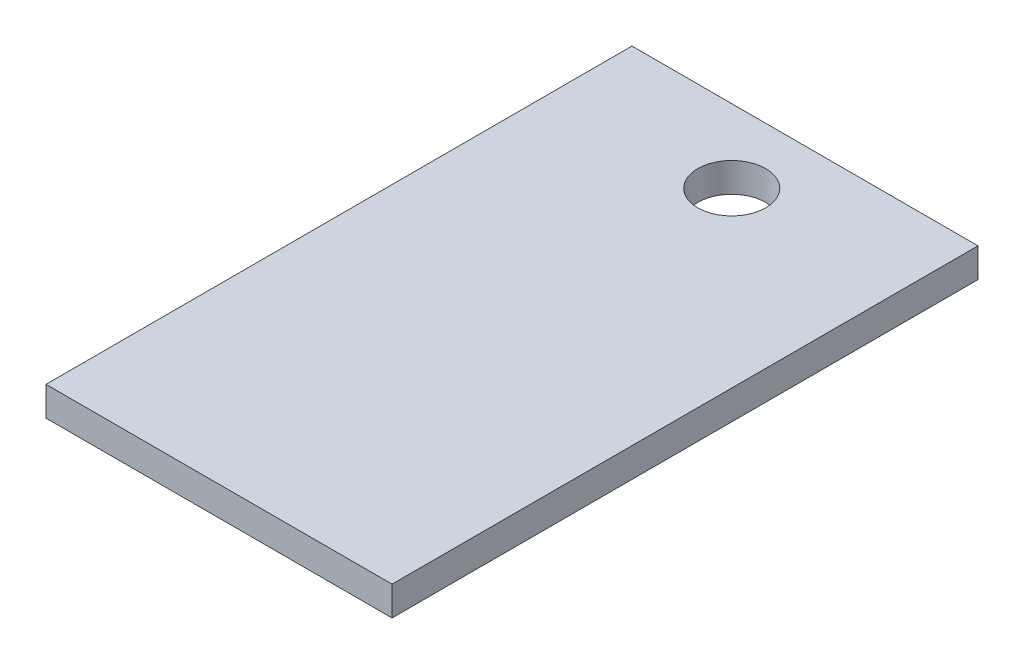
ISO-10303-21;
HEADER;
FILE_DESCRIPTION(('STEP AP214'),'2;1');
FILE_NAME('part.step','',(''),(''),'','','');
FILE_SCHEMA(('AUTOMOTIVE_DESIGN { 1 0 10303 214 1 1 1 1 }'));
ENDSEC;
DATA;
#1=APPLICATION_CONTEXT('core data for automotive mechanical design processes');
#2=APPLICATION_PROTOCOL_DEFINITION('international standard','automotive_design',2000,#1);
#3=PRODUCT_CONTEXT('',#1,'mechanical');
#4=PRODUCT('Part','Part','',(#3));
#5=PRODUCT_RELATED_PRODUCT_CATEGORY('part','',(#4));
#6=PRODUCT_DEFINITION_FORMATION('','',#4);
#7=PRODUCT_DEFINITION_CONTEXT('part definition',#1,'design');
#8=PRODUCT_DEFINITION('design','',#6,#7);
#9=PRODUCT_DEFINITION_SHAPE('','',#8);
#10=(LENGTH_UNIT() NAMED_UNIT(*) SI_UNIT(.MILLI.,.METRE.));
#11=(NAMED_UNIT(*) PLANE_ANGLE_UNIT() SI_UNIT($,.RADIAN.));
#12=(NAMED_UNIT(*) SI_UNIT($,.STERADIAN.) SOLID_ANGLE_UNIT());
#13=UNCERTAINTY_MEASURE_WITH_UNIT(LENGTH_MEASURE(1.E-05),#10,'distance_accuracy_value','');
#14=(GEOMETRIC_REPRESENTATION_CONTEXT(3) GLOBAL_UNCERTAINTY_ASSIGNED_CONTEXT((#13)) GLOBAL_UNIT_ASSIGNED_CONTEXT((#10,
#11,#12)) REPRESENTATION_CONTEXT('',''));
#15=CARTESIAN_POINT('',(0.,0.,0.));
#16=DIRECTION('',(0.,0.,1.));
#17=DIRECTION('',(1.,0.,0.));
#18=AXIS2_PLACEMENT_3D('',#15,#16,#17);
#19=CARTESIAN_POINT('',(0.,1.27,0.));
#20=DIRECTION('',(0.,1.,0.));
#21=DIRECTION('',(0.,0.,1.));
#22=AXIS2_PLACEMENT_3D('',#19,#20,#21);
#23=PLANE('',#22);
#24=DIRECTION('',(0.,0.,1.));
#25=VECTOR('',#24,1.);
#26=CARTESIAN_POINT('',(0.,1.27,0.));
#27=LINE('',#26,#25);
#28=CARTESIAN_POINT('',(0.,1.27,0.));
#29=VERTEX_POINT('',#28);
#30=CARTESIAN_POINT('',(0.,1.27,25.4));
#31=VERTEX_POINT('',#30);
#32=EDGE_CURVE('E96',#29,#31,#27,.T.);
#33=ORIENTED_EDGE('',*,*,#32,.T.);
#34=DIRECTION('',(1.,0.,0.));
#35=VECTOR('',#34,1.);
#36=CARTESIAN_POINT('',(0.,1.27,25.4));
#37=LINE('',#36,#35);
#38=CARTESIAN_POINT('',(15.,1.27,25.4));
#39=VERTEX_POINT('',#38);
#40=EDGE_CURVE('E91',#31,#39,#37,.T.);
#41=ORIENTED_EDGE('',*,*,#40,.T.);
#42=DIRECTION('',(0.,0.,-1.));
#43=VECTOR('',#42,1.);
#44=CARTESIAN_POINT('',(15.,1.27,0.));
#45=LINE('',#44,#43);
#46=CARTESIAN_POINT('',(15.,1.27,0.));
#47=VERTEX_POINT('',#46);
#48=EDGE_CURVE('E94',#39,#47,#45,.T.);
#49=ORIENTED_EDGE('',*,*,#48,.T.);
#50=DIRECTION('',(-1.,0.,0.));
#51=VECTOR('',#50,1.);
#52=CARTESIAN_POINT('',(0.,1.27,0.));
#53=LINE('',#52,#51);
#54=EDGE_CURVE('E61',#47,#29,#53,.T.);
#55=ORIENTED_EDGE('',*,*,#54,.T.);
#56=EDGE_LOOP('',(#33,#41,#49,#55));
#57=FACE_BOUND('',#56,.T.);
#58=CARTESIAN_POINT('',(7.5,1.27,3.175));
#59=DIRECTION('',(0.,1.,0.));
#60=DIRECTION('',(0.,0.,1.));
#61=AXIS2_PLACEMENT_3D('',#58,#59,#60);
#62=CIRCLE('',#61,1.4732);
#63=CARTESIAN_POINT('',(7.5,1.27,4.6482));
#64=VERTEX_POINT('',#63);
#65=EDGE_CURVE('E116',#64,#64,#62,.T.);
#66=ORIENTED_EDGE('',*,*,#65,.F.);
#67=EDGE_LOOP('',(#66));
#68=FACE_BOUND('',#67,.T.);
#69=ADVANCED_FACE('F43',(#57,#68),#23,.T.);
#70=CARTESIAN_POINT('',(0.,0.,0.));
#71=DIRECTION('',(0.,1.,0.));
#72=DIRECTION('',(0.,0.,1.));
#73=AXIS2_PLACEMENT_3D('',#70,#71,#72);
#74=PLANE('',#73);
#75=DIRECTION('',(0.,0.,1.));
#76=VECTOR('',#75,1.);
#77=CARTESIAN_POINT('',(0.,0.,0.));
#78=LINE('',#77,#76);
#79=CARTESIAN_POINT('',(0.,0.,0.));
#80=VERTEX_POINT('',#79);
#81=CARTESIAN_POINT('',(0.,0.,25.4));
#82=VERTEX_POINT('',#81);
#83=EDGE_CURVE('E112',#80,#82,#78,.T.);
#84=ORIENTED_EDGE('',*,*,#83,.F.);
#85=DIRECTION('',(-1.,0.,0.));
#86=VECTOR('',#85,1.);
#87=CARTESIAN_POINT('',(0.,0.,0.));
#88=LINE('',#87,#86);
#89=CARTESIAN_POINT('',(15.,0.,0.));
#90=VERTEX_POINT('',#89);
#91=EDGE_CURVE('E84',#90,#80,#88,.T.);
#92=ORIENTED_EDGE('',*,*,#91,.F.);
#93=DIRECTION('',(0.,0.,-1.));
#94=VECTOR('',#93,1.);
#95=CARTESIAN_POINT('',(15.,0.,0.));
#96=LINE('',#95,#94);
#97=CARTESIAN_POINT('',(15.,0.,25.4));
#98=VERTEX_POINT('',#97);
#99=EDGE_CURVE('E78',#98,#90,#96,.T.);
#100=ORIENTED_EDGE('',*,*,#99,.F.);
#101=DIRECTION('',(1.,0.,0.));
#102=VECTOR('',#101,1.);
#103=CARTESIAN_POINT('',(0.,0.,25.4));
#104=LINE('',#103,#102);
#105=EDGE_CURVE('E101',#82,#98,#104,.T.);
#106=ORIENTED_EDGE('',*,*,#105,.F.);
#107=EDGE_LOOP('',(#84,#92,#100,#106));
#108=FACE_BOUND('',#107,.T.);
#109=CARTESIAN_POINT('',(7.5,0.,3.175));
#110=DIRECTION('',(0.,1.,0.));
#111=DIRECTION('',(0.,0.,1.));
#112=AXIS2_PLACEMENT_3D('',#109,#110,#111);
#113=CIRCLE('',#112,1.4732);
#114=CARTESIAN_POINT('',(7.5,0.,4.6482));
#115=VERTEX_POINT('',#114);
#116=EDGE_CURVE('E134',#115,#115,#113,.T.);
#117=ORIENTED_EDGE('',*,*,#116,.T.);
#118=EDGE_LOOP('',(#117));
#119=FACE_BOUND('',#118,.T.);
#120=ADVANCED_FACE('F129',(#108,#119),#74,.F.);
#121=CARTESIAN_POINT('',(0.,1.27,0.));
#122=DIRECTION('',(1.,0.,0.));
#123=DIRECTION('',(0.,0.,-1.));
#124=AXIS2_PLACEMENT_3D('',#121,#122,#123);
#125=PLANE('',#124);
#126=ORIENTED_EDGE('',*,*,#83,.T.);
#127=DIRECTION('',(0.,-1.,0.));
#128=VECTOR('',#127,1.);
#129=CARTESIAN_POINT('',(0.,1.27,25.4));
#130=LINE('',#129,#128);
#131=EDGE_CURVE('E11',#31,#82,#130,.T.);
#132=ORIENTED_EDGE('',*,*,#131,.F.);
#133=ORIENTED_EDGE('',*,*,#32,.F.);
#134=DIRECTION('',(0.,-1.,0.));
#135=VECTOR('',#134,1.);
#136=CARTESIAN_POINT('',(0.,1.27,0.));
#137=LINE('',#136,#135);
#138=EDGE_CURVE('E108',#29,#80,#137,.T.);
#139=ORIENTED_EDGE('',*,*,#138,.T.);
#140=EDGE_LOOP('',(#126,#132,#133,#139));
#141=FACE_BOUND('',#140,.T.);
#142=ADVANCED_FACE('F45',(#141),#125,.F.);
#143=CARTESIAN_POINT('',(0.,1.27,25.4));
#144=DIRECTION('',(0.,0.,-1.));
#145=DIRECTION('',(-1.,0.,0.));
#146=AXIS2_PLACEMENT_3D('',#143,#144,#145);
#147=PLANE('',#146);
#148=ORIENTED_EDGE('',*,*,#105,.T.);
#149=DIRECTION('',(0.,-1.,0.));
#150=VECTOR('',#149,1.);
#151=CARTESIAN_POINT('',(15.,1.27,25.4));
#152=LINE('',#151,#150);
#153=EDGE_CURVE('E53',#39,#98,#152,.T.);
#154=ORIENTED_EDGE('',*,*,#153,.F.);
#155=ORIENTED_EDGE('',*,*,#40,.F.);
#156=ORIENTED_EDGE('',*,*,#131,.T.);
#157=EDGE_LOOP('',(#148,#154,#155,#156));
#158=FACE_BOUND('',#157,.T.);
#159=ADVANCED_FACE('F100',(#158),#147,.F.);
#160=CARTESIAN_POINT('',(15.,1.27,0.));
#161=DIRECTION('',(-1.,0.,0.));
#162=DIRECTION('',(0.,0.,1.));
#163=AXIS2_PLACEMENT_3D('',#160,#161,#162);
#164=PLANE('',#163);
#165=ORIENTED_EDGE('',*,*,#99,.T.);
#166=DIRECTION('',(0.,-1.,0.));
#167=VECTOR('',#166,1.);
#168=CARTESIAN_POINT('',(15.,1.27,0.));
#169=LINE('',#168,#167);
#170=EDGE_CURVE('E103',#47,#90,#169,.T.);
#171=ORIENTED_EDGE('',*,*,#170,.F.);
#172=ORIENTED_EDGE('',*,*,#48,.F.);
#173=ORIENTED_EDGE('',*,*,#153,.T.);
#174=EDGE_LOOP('',(#165,#171,#172,#173));
#175=FACE_BOUND('',#174,.T.);
#176=ADVANCED_FACE('F104',(#175),#164,.F.);
#177=CARTESIAN_POINT('',(0.,1.27,0.));
#178=DIRECTION('',(0.,0.,1.));
#179=DIRECTION('',(1.,0.,0.));
#180=AXIS2_PLACEMENT_3D('',#177,#178,#179);
#181=PLANE('',#180);
#182=ORIENTED_EDGE('',*,*,#91,.T.);
#183=ORIENTED_EDGE('',*,*,#138,.F.);
#184=ORIENTED_EDGE('',*,*,#54,.F.);
#185=ORIENTED_EDGE('',*,*,#170,.T.);
#186=EDGE_LOOP('',(#182,#183,#184,#185));
#187=FACE_BOUND('',#186,.T.);
#188=ADVANCED_FACE('F126',(#187),#181,.F.);
#189=CARTESIAN_POINT('',(7.5,1.27,3.175));
#190=DIRECTION('',(0.,-1.,0.));
#191=DIRECTION('',(0.,0.,-1.));
#192=AXIS2_PLACEMENT_3D('',#189,#190,#191);
#193=CYLINDRICAL_SURFACE('',#192,1.4732);
#194=ORIENTED_EDGE('',*,*,#65,.T.);
#195=EDGE_LOOP('',(#194));
#196=FACE_BOUND('',#195,.T.);
#197=ORIENTED_EDGE('',*,*,#116,.F.);
#198=EDGE_LOOP('',(#197));
#199=FACE_BOUND('',#198,.T.);
#200=ADVANCED_FACE('F142',(#196,#199),#193,.F.);
#201=CLOSED_SHELL('',(#69,#120,#142,#159,#176,#188,#200));
#202=MANIFOLD_SOLID_BREP('B2',#201);
#203=ADVANCED_BREP_SHAPE_REPRESENTATION('',(#18,#202),#14);
#204=SHAPE_DEFINITION_REPRESENTATION(#9,#203);
ENDSEC;
END-ISO-10303-21;
